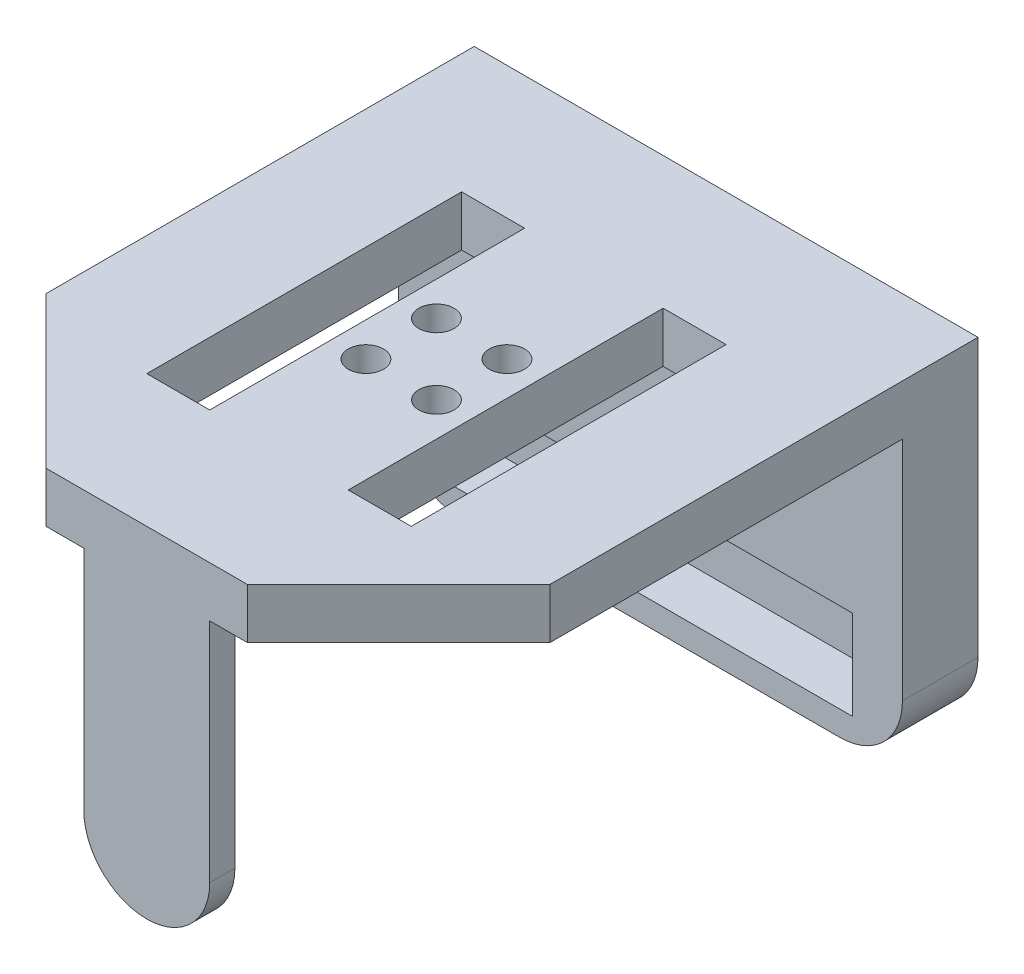
ISO-10303-21;
HEADER;
FILE_DESCRIPTION(('STEP AP214'),'2;1');
FILE_NAME('part.step','',(''),(''),'','','');
FILE_SCHEMA(('AUTOMOTIVE_DESIGN { 1 0 10303 214 1 1 1 1 }'));
ENDSEC;
DATA;
#1=APPLICATION_CONTEXT('core data for automotive mechanical design processes');
#2=APPLICATION_PROTOCOL_DEFINITION('international standard','automotive_design',2000,#1);
#3=PRODUCT_CONTEXT('',#1,'mechanical');
#4=PRODUCT('Part','Part','',(#3));
#5=PRODUCT_RELATED_PRODUCT_CATEGORY('part','',(#4));
#6=PRODUCT_DEFINITION_FORMATION('','',#4);
#7=PRODUCT_DEFINITION_CONTEXT('part definition',#1,'design');
#8=PRODUCT_DEFINITION('design','',#6,#7);
#9=PRODUCT_DEFINITION_SHAPE('','',#8);
#10=(LENGTH_UNIT() NAMED_UNIT(*) SI_UNIT(.MILLI.,.METRE.));
#11=(NAMED_UNIT(*) PLANE_ANGLE_UNIT() SI_UNIT($,.RADIAN.));
#12=(NAMED_UNIT(*) SI_UNIT($,.STERADIAN.) SOLID_ANGLE_UNIT());
#13=UNCERTAINTY_MEASURE_WITH_UNIT(LENGTH_MEASURE(1.E-05),#10,'distance_accuracy_value','');
#14=(GEOMETRIC_REPRESENTATION_CONTEXT(3) GLOBAL_UNCERTAINTY_ASSIGNED_CONTEXT((#13)) GLOBAL_UNIT_ASSIGNED_CONTEXT((#10,
#11,#12)) REPRESENTATION_CONTEXT('',''));
#15=CARTESIAN_POINT('',(0.,0.,0.));
#16=DIRECTION('',(0.,0.,1.));
#17=DIRECTION('',(1.,0.,0.));
#18=AXIS2_PLACEMENT_3D('',#15,#16,#17);
#19=CARTESIAN_POINT('',(-20.,9.5,46.));
#20=DIRECTION('',(0.,1.,0.));
#21=DIRECTION('',(0.,0.,1.));
#22=AXIS2_PLACEMENT_3D('',#19,#20,#21);
#23=PLANE('',#22);
#24=DIRECTION('',(1.,0.,0.));
#25=VECTOR('',#24,1.);
#26=CARTESIAN_POINT('',(-20.,9.5,35.5));
#27=LINE('',#26,#25);
#28=CARTESIAN_POINT('',(-10.5,9.5,35.5));
#29=VERTEX_POINT('',#28);
#30=CARTESIAN_POINT('',(-5.5,9.5,35.5));
#31=VERTEX_POINT('',#30);
#32=EDGE_CURVE('E373',#29,#31,#27,.T.);
#33=ORIENTED_EDGE('',*,*,#32,.T.);
#34=DIRECTION('',(0.,0.,-1.));
#35=VECTOR('',#34,1.);
#36=CARTESIAN_POINT('',(-5.5,9.5,46.));
#37=LINE('',#36,#35);
#38=CARTESIAN_POINT('',(-5.5,9.5,10.5));
#39=VERTEX_POINT('',#38);
#40=EDGE_CURVE('E370',#31,#39,#37,.T.);
#41=ORIENTED_EDGE('',*,*,#40,.T.);
#42=DIRECTION('',(-1.,0.,0.));
#43=VECTOR('',#42,1.);
#44=CARTESIAN_POINT('',(-20.,9.5,10.5));
#45=LINE('',#44,#43);
#46=CARTESIAN_POINT('',(-10.5,9.5,10.5));
#47=VERTEX_POINT('',#46);
#48=EDGE_CURVE('E379',#39,#47,#45,.T.);
#49=ORIENTED_EDGE('',*,*,#48,.T.);
#50=DIRECTION('',(0.,0.,1.));
#51=VECTOR('',#50,1.);
#52=CARTESIAN_POINT('',(-10.5,9.5,46.));
#53=LINE('',#52,#51);
#54=EDGE_CURVE('E376',#47,#29,#53,.T.);
#55=ORIENTED_EDGE('',*,*,#54,.T.);
#56=EDGE_LOOP('',(#33,#41,#49,#55));
#57=FACE_BOUND('',#56,.T.);
#58=CARTESIAN_POINT('',(2.8,9.5,20.2));
#59=DIRECTION('',(0.,1.,0.));
#60=DIRECTION('',(0.,0.,1.));
#61=AXIS2_PLACEMENT_3D('',#58,#59,#60);
#62=CIRCLE('',#61,1.4);
#63=CARTESIAN_POINT('',(2.8,9.5,21.6));
#64=VERTEX_POINT('',#63);
#65=EDGE_CURVE('E382',#64,#64,#62,.T.);
#66=ORIENTED_EDGE('',*,*,#65,.T.);
#67=EDGE_LOOP('',(#66));
#68=FACE_BOUND('',#67,.T.);
#69=CARTESIAN_POINT('',(2.8,9.5,25.8));
#70=DIRECTION('',(0.,1.,0.));
#71=DIRECTION('',(0.,0.,1.));
#72=AXIS2_PLACEMENT_3D('',#69,#70,#71);
#73=CIRCLE('',#72,1.4);
#74=CARTESIAN_POINT('',(2.8,9.5,27.2));
#75=VERTEX_POINT('',#74);
#76=EDGE_CURVE('E385',#75,#75,#73,.T.);
#77=ORIENTED_EDGE('',*,*,#76,.T.);
#78=EDGE_LOOP('',(#77));
#79=FACE_BOUND('',#78,.T.);
#80=CARTESIAN_POINT('',(-2.8,9.5,25.8));
#81=DIRECTION('',(0.,1.,0.));
#82=DIRECTION('',(0.,0.,1.));
#83=AXIS2_PLACEMENT_3D('',#80,#81,#82);
#84=CIRCLE('',#83,1.4);
#85=CARTESIAN_POINT('',(-2.8,9.5,27.2));
#86=VERTEX_POINT('',#85);
#87=EDGE_CURVE('E388',#86,#86,#84,.T.);
#88=ORIENTED_EDGE('',*,*,#87,.T.);
#89=EDGE_LOOP('',(#88));
#90=FACE_BOUND('',#89,.T.);
#91=DIRECTION('',(1.,0.,0.));
#92=VECTOR('',#91,1.);
#93=CARTESIAN_POINT('',(-20.,9.5,35.5));
#94=LINE('',#93,#92);
#95=CARTESIAN_POINT('',(5.50000000000001,9.5,35.5));
#96=VERTEX_POINT('',#95);
#97=CARTESIAN_POINT('',(10.5,9.5,35.5));
#98=VERTEX_POINT('',#97);
#99=EDGE_CURVE('E394',#96,#98,#94,.T.);
#100=ORIENTED_EDGE('',*,*,#99,.T.);
#101=DIRECTION('',(0.,0.,-1.));
#102=VECTOR('',#101,1.);
#103=CARTESIAN_POINT('',(10.5,9.5,46.));
#104=LINE('',#103,#102);
#105=CARTESIAN_POINT('',(10.5,9.5,10.5));
#106=VERTEX_POINT('',#105);
#107=EDGE_CURVE('E391',#98,#106,#104,.T.);
#108=ORIENTED_EDGE('',*,*,#107,.T.);
#109=DIRECTION('',(-1.,0.,0.));
#110=VECTOR('',#109,1.);
#111=CARTESIAN_POINT('',(-20.,9.5,10.5));
#112=LINE('',#111,#110);
#113=CARTESIAN_POINT('',(5.5,9.5,10.5));
#114=VERTEX_POINT('',#113);
#115=EDGE_CURVE('E400',#106,#114,#112,.T.);
#116=ORIENTED_EDGE('',*,*,#115,.T.);
#117=DIRECTION('',(0.,0.,1.));
#118=VECTOR('',#117,1.);
#119=CARTESIAN_POINT('',(5.50000000000001,9.5,46.));
#120=LINE('',#119,#118);
#121=EDGE_CURVE('E397',#114,#96,#120,.T.);
#122=ORIENTED_EDGE('',*,*,#121,.T.);
#123=EDGE_LOOP('',(#100,#108,#116,#122));
#124=FACE_BOUND('',#123,.T.);
#125=CARTESIAN_POINT('',(-2.8,9.5,20.2));
#126=DIRECTION('',(0.,1.,0.));
#127=DIRECTION('',(0.,0.,1.));
#128=AXIS2_PLACEMENT_3D('',#125,#126,#127);
#129=CIRCLE('',#128,1.4);
#130=CARTESIAN_POINT('',(-2.8,9.5,21.6));
#131=VERTEX_POINT('',#130);
#132=EDGE_CURVE('E403',#131,#131,#129,.T.);
#133=ORIENTED_EDGE('',*,*,#132,.T.);
#134=EDGE_LOOP('',(#133));
#135=FACE_BOUND('',#134,.T.);
#136=DIRECTION('',(0.,0.,-1.));
#137=VECTOR('',#136,1.);
#138=CARTESIAN_POINT('',(20.,9.5,46.));
#139=LINE('',#138,#137);
#140=CARTESIAN_POINT('',(20.,9.5,34.));
#141=VERTEX_POINT('',#140);
#142=CARTESIAN_POINT('',(20.,9.5,6.));
#143=VERTEX_POINT('',#142);
#144=EDGE_CURVE('E286',#141,#143,#139,.T.);
#145=ORIENTED_EDGE('',*,*,#144,.F.);
#146=DIRECTION('',(-0.707106781186548,0.,0.707106781186547));
#147=VECTOR('',#146,1.);
#148=CARTESIAN_POINT('',(-6.00000000000002,9.5,60.));
#149=LINE('',#148,#147);
#150=CARTESIAN_POINT('',(7.99999999999999,9.5,46.));
#151=VERTEX_POINT('',#150);
#152=EDGE_CURVE('E220',#141,#151,#149,.T.);
#153=ORIENTED_EDGE('',*,*,#152,.T.);
#154=DIRECTION('',(1.,0.,0.));
#155=VECTOR('',#154,1.);
#156=CARTESIAN_POINT('',(-20.,9.5,46.));
#157=LINE('',#156,#155);
#158=CARTESIAN_POINT('',(5.,9.5,46.));
#159=VERTEX_POINT('',#158);
#160=EDGE_CURVE('E348',#159,#151,#157,.T.);
#161=ORIENTED_EDGE('',*,*,#160,.F.);
#162=DIRECTION('',(0.,0.,1.));
#163=VECTOR('',#162,1.);
#164=CARTESIAN_POINT('',(5.,9.5,46.));
#165=LINE('',#164,#163);
#166=CARTESIAN_POINT('',(5.,9.5,44.));
#167=VERTEX_POINT('',#166);
#168=EDGE_CURVE('E361',#167,#159,#165,.T.);
#169=ORIENTED_EDGE('',*,*,#168,.F.);
#170=DIRECTION('',(1.,0.,0.));
#171=VECTOR('',#170,1.);
#172=CARTESIAN_POINT('',(-5.,9.5,44.));
#173=LINE('',#172,#171);
#174=CARTESIAN_POINT('',(-5.,9.5,44.));
#175=VERTEX_POINT('',#174);
#176=EDGE_CURVE('E364',#175,#167,#173,.T.);
#177=ORIENTED_EDGE('',*,*,#176,.F.);
#178=DIRECTION('',(0.,0.,-1.));
#179=VECTOR('',#178,1.);
#180=CARTESIAN_POINT('',(-5.,9.5,46.));
#181=LINE('',#180,#179);
#182=CARTESIAN_POINT('',(-5.,9.5,46.));
#183=VERTEX_POINT('',#182);
#184=EDGE_CURVE('E367',#183,#175,#181,.T.);
#185=ORIENTED_EDGE('',*,*,#184,.F.);
#186=CARTESIAN_POINT('',(-7.99999999999999,9.5,46.));
#187=VERTEX_POINT('',#186);
#188=EDGE_CURVE('E351',#187,#183,#157,.T.);
#189=ORIENTED_EDGE('',*,*,#188,.F.);
#190=DIRECTION('',(-0.707106781186548,0.,-0.707106781186547));
#191=VECTOR('',#190,1.);
#192=CARTESIAN_POINT('',(-14.,9.5,40.));
#193=LINE('',#192,#191);
#194=CARTESIAN_POINT('',(-20.,9.5,34.));
#195=VERTEX_POINT('',#194);
#196=EDGE_CURVE('E407',#187,#195,#193,.T.);
#197=ORIENTED_EDGE('',*,*,#196,.T.);
#198=DIRECTION('',(0.,0.,-1.));
#199=VECTOR('',#198,1.);
#200=CARTESIAN_POINT('',(-20.,9.5,46.));
#201=LINE('',#200,#199);
#202=CARTESIAN_POINT('',(-20.,9.5,6.));
#203=VERTEX_POINT('',#202);
#204=EDGE_CURVE('E344',#195,#203,#201,.T.);
#205=ORIENTED_EDGE('',*,*,#204,.T.);
#206=DIRECTION('',(1.,0.,0.));
#207=VECTOR('',#206,1.);
#208=CARTESIAN_POINT('',(-20.,9.5,6.));
#209=LINE('',#208,#207);
#210=EDGE_CURVE('E346',#203,#143,#209,.T.);
#211=ORIENTED_EDGE('',*,*,#210,.T.);
#212=EDGE_LOOP('',(#145,#153,#161,#169,#177,#185,#189,#197,#205,#211));
#213=FACE_BOUND('',#212,.T.);
#214=ADVANCED_FACE('F33',(#57,#68,#79,#90,#124,#135,#213),#23,.F.);
#215=CARTESIAN_POINT('',(0.,0.,6.));
#216=DIRECTION('',(0.,0.,-1.));
#217=DIRECTION('',(-1.,0.,0.));
#218=AXIS2_PLACEMENT_3D('',#215,#216,#217);
#219=PLANE('',#218);
#220=DIRECTION('',(-1.,0.,0.));
#221=VECTOR('',#220,1.);
#222=CARTESIAN_POINT('',(-16.05,-4.45,6.));
#223=LINE('',#222,#221);
#224=CARTESIAN_POINT('',(16.05,-4.45,6.));
#225=VERTEX_POINT('',#224);
#226=CARTESIAN_POINT('',(-16.05,-4.45,6.));
#227=VERTEX_POINT('',#226);
#228=EDGE_CURVE('E322',#225,#227,#223,.T.);
#229=ORIENTED_EDGE('',*,*,#228,.F.);
#230=DIRECTION('',(0.,1.,0.));
#231=VECTOR('',#230,1.);
#232=CARTESIAN_POINT('',(16.05,-4.45,6.));
#233=LINE('',#232,#231);
#234=CARTESIAN_POINT('',(16.05,-11.55,6.));
#235=VERTEX_POINT('',#234);
#236=EDGE_CURVE('E325',#235,#225,#233,.T.);
#237=ORIENTED_EDGE('',*,*,#236,.F.);
#238=DIRECTION('',(1.,0.,0.));
#239=VECTOR('',#238,1.);
#240=CARTESIAN_POINT('',(-16.05,-11.55,6.));
#241=LINE('',#240,#239);
#242=CARTESIAN_POINT('',(-16.05,-11.55,6.));
#243=VERTEX_POINT('',#242);
#244=EDGE_CURVE('E315',#243,#235,#241,.T.);
#245=ORIENTED_EDGE('',*,*,#244,.F.);
#246=DIRECTION('',(0.,-1.,0.));
#247=VECTOR('',#246,1.);
#248=CARTESIAN_POINT('',(-16.05,-4.45,6.));
#249=LINE('',#248,#247);
#250=EDGE_CURVE('E319',#227,#243,#249,.T.);
#251=ORIENTED_EDGE('',*,*,#250,.F.);
#252=EDGE_LOOP('',(#229,#237,#245,#251));
#253=FACE_BOUND('',#252,.T.);
#254=DIRECTION('',(1.,0.,0.));
#255=VECTOR('',#254,1.);
#256=CARTESIAN_POINT('',(-20.,-13.5,6.));
#257=LINE('',#256,#255);
#258=CARTESIAN_POINT('',(-15.,-13.5,6.));
#259=VERTEX_POINT('',#258);
#260=CARTESIAN_POINT('',(15.,-13.5,6.));
#261=VERTEX_POINT('',#260);
#262=EDGE_CURVE('E249',#259,#261,#257,.T.);
#263=ORIENTED_EDGE('',*,*,#262,.T.);
#264=CARTESIAN_POINT('',(15.,-8.5,6.));
#265=DIRECTION('',(0.,0.,-1.));
#266=DIRECTION('',(-1.,0.,0.));
#267=AXIS2_PLACEMENT_3D('',#264,#265,#266);
#268=CIRCLE('',#267,5.);
#269=CARTESIAN_POINT('',(20.,-8.5,6.));
#270=VERTEX_POINT('',#269);
#271=EDGE_CURVE('E42',#261,#270,#268,.F.);
#272=ORIENTED_EDGE('',*,*,#271,.T.);
#273=DIRECTION('',(0.,1.,0.));
#274=VECTOR('',#273,1.);
#275=CARTESIAN_POINT('',(20.,-13.5,6.));
#276=LINE('',#275,#274);
#277=EDGE_CURVE('E283',#270,#143,#276,.T.);
#278=ORIENTED_EDGE('',*,*,#277,.T.);
#279=ORIENTED_EDGE('',*,*,#210,.F.);
#280=DIRECTION('',(0.,-1.,0.));
#281=VECTOR('',#280,1.);
#282=CARTESIAN_POINT('',(-20.,-13.5,6.));
#283=LINE('',#282,#281);
#284=CARTESIAN_POINT('',(-20.,-8.5,6.));
#285=VERTEX_POINT('',#284);
#286=EDGE_CURVE('E288',#203,#285,#283,.T.);
#287=ORIENTED_EDGE('',*,*,#286,.T.);
#288=CARTESIAN_POINT('',(-15.,-8.5,6.));
#289=DIRECTION('',(0.,0.,-1.));
#290=DIRECTION('',(-1.,0.,0.));
#291=AXIS2_PLACEMENT_3D('',#288,#289,#290);
#292=CIRCLE('',#291,5.);
#293=EDGE_CURVE('E277',#285,#259,#292,.F.);
#294=ORIENTED_EDGE('',*,*,#293,.T.);
#295=EDGE_LOOP('',(#263,#272,#278,#279,#287,#294));
#296=FACE_BOUND('',#295,.T.);
#297=ADVANCED_FACE('F281',(#253,#296),#219,.F.);
#298=CARTESIAN_POINT('',(20.,-13.5,6.));
#299=DIRECTION('',(-1.,0.,0.));
#300=DIRECTION('',(0.,0.,1.));
#301=AXIS2_PLACEMENT_3D('',#298,#299,#300);
#302=PLANE('',#301);
#303=ORIENTED_EDGE('',*,*,#277,.F.);
#304=DIRECTION('',(0.,0.,-1.));
#305=VECTOR('',#304,1.);
#306=CARTESIAN_POINT('',(20.,-8.5,6.));
#307=LINE('',#306,#305);
#308=CARTESIAN_POINT('',(20.,-8.5,0.));
#309=VERTEX_POINT('',#308);
#310=EDGE_CURVE('E267',#270,#309,#307,.T.);
#311=ORIENTED_EDGE('',*,*,#310,.T.);
#312=DIRECTION('',(0.,1.,0.));
#313=VECTOR('',#312,1.);
#314=CARTESIAN_POINT('',(20.,-13.5,0.));
#315=LINE('',#314,#313);
#316=CARTESIAN_POINT('',(20.,13.5,0.));
#317=VERTEX_POINT('',#316);
#318=EDGE_CURVE('E242',#309,#317,#315,.T.);
#319=ORIENTED_EDGE('',*,*,#318,.T.);
#320=DIRECTION('',(0.,0.,-1.));
#321=VECTOR('',#320,1.);
#322=CARTESIAN_POINT('',(20.,13.5,6.));
#323=LINE('',#322,#321);
#324=CARTESIAN_POINT('',(20.,13.5,34.));
#325=VERTEX_POINT('',#324);
#326=EDGE_CURVE('E232',#325,#317,#323,.T.);
#327=ORIENTED_EDGE('',*,*,#326,.F.);
#328=DIRECTION('',(0.,1.,0.));
#329=VECTOR('',#328,1.);
#330=CARTESIAN_POINT('',(20.,-13.5,34.));
#331=LINE('',#330,#329);
#332=EDGE_CURVE('E214',#141,#325,#331,.T.);
#333=ORIENTED_EDGE('',*,*,#332,.F.);
#334=ORIENTED_EDGE('',*,*,#144,.T.);
#335=EDGE_LOOP('',(#303,#311,#319,#327,#333,#334));
#336=FACE_BOUND('',#335,.T.);
#337=ADVANCED_FACE('F239',(#336),#302,.F.);
#338=CARTESIAN_POINT('',(-20.,13.5,6.));
#339=DIRECTION('',(0.,-1.,0.));
#340=DIRECTION('',(0.,0.,-1.));
#341=AXIS2_PLACEMENT_3D('',#338,#339,#340);
#342=PLANE('',#341);
#343=DIRECTION('',(-1.,0.,0.));
#344=VECTOR('',#343,1.);
#345=CARTESIAN_POINT('',(-10.5,13.5,10.5));
#346=LINE('',#345,#344);
#347=CARTESIAN_POINT('',(-5.5,13.5,10.5));
#348=VERTEX_POINT('',#347);
#349=CARTESIAN_POINT('',(-10.5,13.5,10.5));
#350=VERTEX_POINT('',#349);
#351=EDGE_CURVE('E435',#348,#350,#346,.T.);
#352=ORIENTED_EDGE('',*,*,#351,.F.);
#353=DIRECTION('',(0.,0.,-1.));
#354=VECTOR('',#353,1.);
#355=CARTESIAN_POINT('',(-5.5,13.5,35.5));
#356=LINE('',#355,#354);
#357=CARTESIAN_POINT('',(-5.5,13.5,35.5));
#358=VERTEX_POINT('',#357);
#359=EDGE_CURVE('E438',#358,#348,#356,.T.);
#360=ORIENTED_EDGE('',*,*,#359,.F.);
#361=DIRECTION('',(1.,0.,0.));
#362=VECTOR('',#361,1.);
#363=CARTESIAN_POINT('',(-10.5,13.5,35.5));
#364=LINE('',#363,#362);
#365=CARTESIAN_POINT('',(-10.5,13.5,35.5));
#366=VERTEX_POINT('',#365);
#367=EDGE_CURVE('E424',#366,#358,#364,.T.);
#368=ORIENTED_EDGE('',*,*,#367,.F.);
#369=DIRECTION('',(0.,0.,1.));
#370=VECTOR('',#369,1.);
#371=CARTESIAN_POINT('',(-10.5,13.5,35.5));
#372=LINE('',#371,#370);
#373=EDGE_CURVE('E432',#350,#366,#372,.T.);
#374=ORIENTED_EDGE('',*,*,#373,.F.);
#375=EDGE_LOOP('',(#352,#360,#368,#374));
#376=FACE_BOUND('',#375,.T.);
#377=CARTESIAN_POINT('',(2.8,13.5,20.2));
#378=DIRECTION('',(0.,1.,0.));
#379=DIRECTION('',(0.,0.,-1.));
#380=AXIS2_PLACEMENT_3D('',#377,#378,#379);
#381=CIRCLE('',#380,1.4);
#382=CARTESIAN_POINT('',(2.8,13.5,18.8));
#383=VERTEX_POINT('',#382);
#384=EDGE_CURVE('E417',#383,#383,#381,.T.);
#385=ORIENTED_EDGE('',*,*,#384,.F.);
#386=EDGE_LOOP('',(#385));
#387=FACE_BOUND('',#386,.T.);
#388=CARTESIAN_POINT('',(2.8,13.5,25.8));
#389=DIRECTION('',(0.,1.,0.));
#390=DIRECTION('',(0.,0.,1.));
#391=AXIS2_PLACEMENT_3D('',#388,#389,#390);
#392=CIRCLE('',#391,1.4);
#393=CARTESIAN_POINT('',(2.8,13.5,27.2));
#394=VERTEX_POINT('',#393);
#395=EDGE_CURVE('E414',#394,#394,#392,.T.);
#396=ORIENTED_EDGE('',*,*,#395,.F.);
#397=EDGE_LOOP('',(#396));
#398=FACE_BOUND('',#397,.T.);
#399=CARTESIAN_POINT('',(-2.8,13.5,25.8));
#400=DIRECTION('',(0.,1.,0.));
#401=DIRECTION('',(0.,0.,-1.));
#402=AXIS2_PLACEMENT_3D('',#399,#400,#401);
#403=CIRCLE('',#402,1.4);
#404=CARTESIAN_POINT('',(-2.8,13.5,24.4));
#405=VERTEX_POINT('',#404);
#406=EDGE_CURVE('E413',#405,#405,#403,.T.);
#407=ORIENTED_EDGE('',*,*,#406,.F.);
#408=EDGE_LOOP('',(#407));
#409=FACE_BOUND('',#408,.T.);
#410=DIRECTION('',(-1.,0.,0.));
#411=VECTOR('',#410,1.);
#412=CARTESIAN_POINT('',(10.5,13.5,10.5));
#413=LINE('',#412,#411);
#414=CARTESIAN_POINT('',(10.5,13.5,10.5));
#415=VERTEX_POINT('',#414);
#416=CARTESIAN_POINT('',(5.5,13.5,10.5));
#417=VERTEX_POINT('',#416);
#418=EDGE_CURVE('E462',#415,#417,#413,.T.);
#419=ORIENTED_EDGE('',*,*,#418,.F.);
#420=DIRECTION('',(0.,0.,-1.));
#421=VECTOR('',#420,1.);
#422=CARTESIAN_POINT('',(10.5,13.5,35.5));
#423=LINE('',#422,#421);
#424=CARTESIAN_POINT('',(10.5,13.5,35.5));
#425=VERTEX_POINT('',#424);
#426=EDGE_CURVE('E446',#425,#415,#423,.T.);
#427=ORIENTED_EDGE('',*,*,#426,.F.);
#428=DIRECTION('',(1.,0.,0.));
#429=VECTOR('',#428,1.);
#430=CARTESIAN_POINT('',(10.5,13.5,35.5));
#431=LINE('',#430,#429);
#432=CARTESIAN_POINT('',(5.50000000000001,13.5,35.5));
#433=VERTEX_POINT('',#432);
#434=EDGE_CURVE('E452',#433,#425,#431,.T.);
#435=ORIENTED_EDGE('',*,*,#434,.F.);
#436=DIRECTION('',(0.,0.,1.));
#437=VECTOR('',#436,1.);
#438=CARTESIAN_POINT('',(5.50000000000001,13.5,35.5));
#439=LINE('',#438,#437);
#440=EDGE_CURVE('E459',#417,#433,#439,.T.);
#441=ORIENTED_EDGE('',*,*,#440,.F.);
#442=EDGE_LOOP('',(#419,#427,#435,#441));
#443=FACE_BOUND('',#442,.T.);
#444=CARTESIAN_POINT('',(-2.8,13.5,20.2));
#445=DIRECTION('',(0.,1.,0.));
#446=DIRECTION('',(0.,0.,1.));
#447=AXIS2_PLACEMENT_3D('',#444,#445,#446);
#448=CIRCLE('',#447,1.4);
#449=CARTESIAN_POINT('',(-2.8,13.5,21.6));
#450=VERTEX_POINT('',#449);
#451=EDGE_CURVE('E410',#450,#450,#448,.T.);
#452=ORIENTED_EDGE('',*,*,#451,.F.);
#453=EDGE_LOOP('',(#452));
#454=FACE_BOUND('',#453,.T.);
#455=DIRECTION('',(1.,0.,0.));
#456=VECTOR('',#455,1.);
#457=CARTESIAN_POINT('',(-20.,13.5,46.));
#458=LINE('',#457,#456);
#459=CARTESIAN_POINT('',(-8.,13.5,46.));
#460=VERTEX_POINT('',#459);
#461=CARTESIAN_POINT('',(7.99999999999999,13.5,46.));
#462=VERTEX_POINT('',#461);
#463=EDGE_CURVE('E236',#460,#462,#458,.T.);
#464=ORIENTED_EDGE('',*,*,#463,.T.);
#465=DIRECTION('',(-0.707106781186548,0.,0.707106781186547));
#466=VECTOR('',#465,1.);
#467=CARTESIAN_POINT('',(20.,13.5,34.));
#468=LINE('',#467,#466);
#469=EDGE_CURVE('E217',#325,#462,#468,.T.);
#470=ORIENTED_EDGE('',*,*,#469,.F.);
#471=ORIENTED_EDGE('',*,*,#326,.T.);
#472=DIRECTION('',(-1.,0.,0.));
#473=VECTOR('',#472,1.);
#474=CARTESIAN_POINT('',(-20.,13.5,0.));
#475=LINE('',#474,#473);
#476=CARTESIAN_POINT('',(-20.,13.5,0.));
#477=VERTEX_POINT('',#476);
#478=EDGE_CURVE('E298',#317,#477,#475,.T.);
#479=ORIENTED_EDGE('',*,*,#478,.T.);
#480=DIRECTION('',(0.,0.,-1.));
#481=VECTOR('',#480,1.);
#482=CARTESIAN_POINT('',(-20.,13.5,6.));
#483=LINE('',#482,#481);
#484=CARTESIAN_POINT('',(-20.,13.5,34.));
#485=VERTEX_POINT('',#484);
#486=EDGE_CURVE('E244',#485,#477,#483,.T.);
#487=ORIENTED_EDGE('',*,*,#486,.F.);
#488=DIRECTION('',(-0.707106781186548,0.,-0.707106781186547));
#489=VECTOR('',#488,1.);
#490=CARTESIAN_POINT('',(-20.,13.5,34.));
#491=LINE('',#490,#489);
#492=EDGE_CURVE('E225',#460,#485,#491,.T.);
#493=ORIENTED_EDGE('',*,*,#492,.F.);
#494=EDGE_LOOP('',(#464,#470,#471,#479,#487,#493));
#495=FACE_BOUND('',#494,.T.);
#496=ADVANCED_FACE('F230',(#376,#387,#398,#409,#443,#454,#495),#342,.F.);
#497=CARTESIAN_POINT('',(-20.,-13.5,6.));
#498=DIRECTION('',(1.,0.,0.));
#499=DIRECTION('',(0.,0.,-1.));
#500=AXIS2_PLACEMENT_3D('',#497,#498,#499);
#501=PLANE('',#500);
#502=DIRECTION('',(0.,-1.,0.));
#503=VECTOR('',#502,1.);
#504=CARTESIAN_POINT('',(-20.,-13.5,0.));
#505=LINE('',#504,#503);
#506=CARTESIAN_POINT('',(-20.,-8.5,0.));
#507=VERTEX_POINT('',#506);
#508=EDGE_CURVE('E297',#477,#507,#505,.T.);
#509=ORIENTED_EDGE('',*,*,#508,.T.);
#510=DIRECTION('',(0.,0.,-1.));
#511=VECTOR('',#510,1.);
#512=CARTESIAN_POINT('',(-20.,-8.5,6.));
#513=LINE('',#512,#511);
#514=EDGE_CURVE('E11',#507,#285,#513,.F.);
#515=ORIENTED_EDGE('',*,*,#514,.T.);
#516=ORIENTED_EDGE('',*,*,#286,.F.);
#517=ORIENTED_EDGE('',*,*,#204,.F.);
#518=DIRECTION('',(0.,1.,0.));
#519=VECTOR('',#518,1.);
#520=CARTESIAN_POINT('',(-20.,-13.5,34.));
#521=LINE('',#520,#519);
#522=EDGE_CURVE('E443',#195,#485,#521,.T.);
#523=ORIENTED_EDGE('',*,*,#522,.T.);
#524=ORIENTED_EDGE('',*,*,#486,.T.);
#525=EDGE_LOOP('',(#509,#515,#516,#517,#523,#524));
#526=FACE_BOUND('',#525,.T.);
#527=ADVANCED_FACE('F537',(#526),#501,.F.);
#528=CARTESIAN_POINT('',(-20.,-13.5,6.));
#529=DIRECTION('',(0.,1.,0.));
#530=DIRECTION('',(0.,0.,1.));
#531=AXIS2_PLACEMENT_3D('',#528,#529,#530);
#532=PLANE('',#531);
#533=DIRECTION('',(1.,0.,0.));
#534=VECTOR('',#533,1.);
#535=CARTESIAN_POINT('',(-20.,-13.5,0.));
#536=LINE('',#535,#534);
#537=CARTESIAN_POINT('',(-15.,-13.5,0.));
#538=VERTEX_POINT('',#537);
#539=CARTESIAN_POINT('',(15.,-13.5,0.));
#540=VERTEX_POINT('',#539);
#541=EDGE_CURVE('E289',#538,#540,#536,.T.);
#542=ORIENTED_EDGE('',*,*,#541,.T.);
#543=DIRECTION('',(0.,0.,-1.));
#544=VECTOR('',#543,1.);
#545=CARTESIAN_POINT('',(15.,-13.5,6.));
#546=LINE('',#545,#544);
#547=EDGE_CURVE('E55',#540,#261,#546,.F.);
#548=ORIENTED_EDGE('',*,*,#547,.T.);
#549=ORIENTED_EDGE('',*,*,#262,.F.);
#550=DIRECTION('',(0.,0.,-1.));
#551=VECTOR('',#550,1.);
#552=CARTESIAN_POINT('',(-15.,-13.5,6.));
#553=LINE('',#552,#551);
#554=EDGE_CURVE('E273',#259,#538,#553,.T.);
#555=ORIENTED_EDGE('',*,*,#554,.T.);
#556=EDGE_LOOP('',(#542,#548,#549,#555));
#557=FACE_BOUND('',#556,.T.);
#558=ADVANCED_FACE('F295',(#557),#532,.F.);
#559=CARTESIAN_POINT('',(0.,0.,0.));
#560=DIRECTION('',(0.,0.,-1.));
#561=DIRECTION('',(-1.,0.,0.));
#562=AXIS2_PLACEMENT_3D('',#559,#560,#561);
#563=PLANE('',#562);
#564=CARTESIAN_POINT('',(0.,-8.,0.));
#565=DIRECTION('',(0.,0.,1.));
#566=DIRECTION('',(1.,0.,0.));
#567=AXIS2_PLACEMENT_3D('',#564,#565,#566);
#568=CIRCLE('',#567,1.05);
#569=CARTESIAN_POINT('',(1.05,-8.,0.));
#570=VERTEX_POINT('',#569);
#571=EDGE_CURVE('E327',#570,#570,#568,.T.);
#572=ORIENTED_EDGE('',*,*,#571,.T.);
#573=EDGE_LOOP('',(#572));
#574=FACE_BOUND('',#573,.T.);
#575=ORIENTED_EDGE('',*,*,#318,.F.);
#576=CARTESIAN_POINT('',(15.,-8.5,0.));
#577=DIRECTION('',(0.,0.,-1.));
#578=DIRECTION('',(-1.,0.,0.));
#579=AXIS2_PLACEMENT_3D('',#576,#577,#578);
#580=CIRCLE('',#579,5.);
#581=EDGE_CURVE('E271',#309,#540,#580,.T.);
#582=ORIENTED_EDGE('',*,*,#581,.T.);
#583=ORIENTED_EDGE('',*,*,#541,.F.);
#584=CARTESIAN_POINT('',(-15.,-8.5,0.));
#585=DIRECTION('',(0.,0.,-1.));
#586=DIRECTION('',(-1.,0.,0.));
#587=AXIS2_PLACEMENT_3D('',#584,#585,#586);
#588=CIRCLE('',#587,5.);
#589=EDGE_CURVE('E269',#538,#507,#588,.T.);
#590=ORIENTED_EDGE('',*,*,#589,.T.);
#591=ORIENTED_EDGE('',*,*,#508,.F.);
#592=ORIENTED_EDGE('',*,*,#478,.F.);
#593=EDGE_LOOP('',(#575,#582,#583,#590,#591,#592));
#594=FACE_BOUND('',#593,.T.);
#595=ADVANCED_FACE('F294',(#574,#594),#563,.T.);
#596=CARTESIAN_POINT('',(16.05,-4.45,2.));
#597=DIRECTION('',(1.,0.,0.));
#598=DIRECTION('',(0.,0.,-1.));
#599=AXIS2_PLACEMENT_3D('',#596,#597,#598);
#600=PLANE('',#599);
#601=ORIENTED_EDGE('',*,*,#236,.T.);
#602=DIRECTION('',(0.,0.,1.));
#603=VECTOR('',#602,1.);
#604=CARTESIAN_POINT('',(16.05,-4.45,2.));
#605=LINE('',#604,#603);
#606=CARTESIAN_POINT('',(16.05,-4.45,2.));
#607=VERTEX_POINT('',#606);
#608=EDGE_CURVE('E306',#607,#225,#605,.T.);
#609=ORIENTED_EDGE('',*,*,#608,.F.);
#610=DIRECTION('',(0.,1.,0.));
#611=VECTOR('',#610,1.);
#612=CARTESIAN_POINT('',(16.05,-4.45,2.));
#613=LINE('',#612,#611);
#614=CARTESIAN_POINT('',(16.05,-11.55,2.));
#615=VERTEX_POINT('',#614);
#616=EDGE_CURVE('E318',#615,#607,#613,.T.);
#617=ORIENTED_EDGE('',*,*,#616,.F.);
#618=DIRECTION('',(0.,0.,1.));
#619=VECTOR('',#618,1.);
#620=CARTESIAN_POINT('',(16.05,-11.55,2.));
#621=LINE('',#620,#619);
#622=EDGE_CURVE('E303',#615,#235,#621,.T.);
#623=ORIENTED_EDGE('',*,*,#622,.T.);
#624=EDGE_LOOP('',(#601,#609,#617,#623));
#625=FACE_BOUND('',#624,.T.);
#626=ADVANCED_FACE('F521',(#625),#600,.F.);
#627=CARTESIAN_POINT('',(-16.05,-11.55,2.));
#628=DIRECTION('',(0.,-1.,0.));
#629=DIRECTION('',(0.,0.,-1.));
#630=AXIS2_PLACEMENT_3D('',#627,#628,#629);
#631=PLANE('',#630);
#632=ORIENTED_EDGE('',*,*,#244,.T.);
#633=ORIENTED_EDGE('',*,*,#622,.F.);
#634=DIRECTION('',(1.,0.,0.));
#635=VECTOR('',#634,1.);
#636=CARTESIAN_POINT('',(-16.05,-11.55,2.));
#637=LINE('',#636,#635);
#638=CARTESIAN_POINT('',(-16.05,-11.55,2.));
#639=VERTEX_POINT('',#638);
#640=EDGE_CURVE('E310',#639,#615,#637,.T.);
#641=ORIENTED_EDGE('',*,*,#640,.F.);
#642=DIRECTION('',(0.,0.,1.));
#643=VECTOR('',#642,1.);
#644=CARTESIAN_POINT('',(-16.05,-11.55,2.));
#645=LINE('',#644,#643);
#646=EDGE_CURVE('E312',#639,#243,#645,.T.);
#647=ORIENTED_EDGE('',*,*,#646,.T.);
#648=EDGE_LOOP('',(#632,#633,#641,#647));
#649=FACE_BOUND('',#648,.T.);
#650=ADVANCED_FACE('F517',(#649),#631,.F.);
#651=CARTESIAN_POINT('',(-16.05,-4.45,2.));
#652=DIRECTION('',(-1.,0.,0.));
#653=DIRECTION('',(0.,0.,1.));
#654=AXIS2_PLACEMENT_3D('',#651,#652,#653);
#655=PLANE('',#654);
#656=ORIENTED_EDGE('',*,*,#250,.T.);
#657=ORIENTED_EDGE('',*,*,#646,.F.);
#658=DIRECTION('',(0.,-1.,0.));
#659=VECTOR('',#658,1.);
#660=CARTESIAN_POINT('',(-16.05,-4.45,2.));
#661=LINE('',#660,#659);
#662=CARTESIAN_POINT('',(-16.05,-4.45,2.));
#663=VERTEX_POINT('',#662);
#664=EDGE_CURVE('E330',#663,#639,#661,.T.);
#665=ORIENTED_EDGE('',*,*,#664,.F.);
#666=DIRECTION('',(0.,0.,1.));
#667=VECTOR('',#666,1.);
#668=CARTESIAN_POINT('',(-16.05,-4.45,2.));
#669=LINE('',#668,#667);
#670=EDGE_CURVE('E309',#663,#227,#669,.T.);
#671=ORIENTED_EDGE('',*,*,#670,.T.);
#672=EDGE_LOOP('',(#656,#657,#665,#671));
#673=FACE_BOUND('',#672,.T.);
#674=ADVANCED_FACE('F520',(#673),#655,.F.);
#675=CARTESIAN_POINT('',(-16.05,-4.45,2.));
#676=DIRECTION('',(0.,1.,0.));
#677=DIRECTION('',(0.,0.,1.));
#678=AXIS2_PLACEMENT_3D('',#675,#676,#677);
#679=PLANE('',#678);
#680=ORIENTED_EDGE('',*,*,#228,.T.);
#681=ORIENTED_EDGE('',*,*,#670,.F.);
#682=DIRECTION('',(-1.,0.,0.));
#683=VECTOR('',#682,1.);
#684=CARTESIAN_POINT('',(-16.05,-4.45,2.));
#685=LINE('',#684,#683);
#686=EDGE_CURVE('E333',#607,#663,#685,.T.);
#687=ORIENTED_EDGE('',*,*,#686,.F.);
#688=ORIENTED_EDGE('',*,*,#608,.T.);
#689=EDGE_LOOP('',(#680,#681,#687,#688));
#690=FACE_BOUND('',#689,.T.);
#691=ADVANCED_FACE('F515',(#690),#679,.F.);
#692=CARTESIAN_POINT('',(0.,0.,2.));
#693=DIRECTION('',(0.,0.,1.));
#694=DIRECTION('',(1.,0.,0.));
#695=AXIS2_PLACEMENT_3D('',#692,#693,#694);
#696=PLANE('',#695);
#697=CARTESIAN_POINT('',(0.,-8.,2.));
#698=DIRECTION('',(0.,0.,1.));
#699=DIRECTION('',(1.,0.,0.));
#700=AXIS2_PLACEMENT_3D('',#697,#698,#699);
#701=CIRCLE('',#700,1.05);
#702=CARTESIAN_POINT('',(1.05,-8.,2.));
#703=VERTEX_POINT('',#702);
#704=EDGE_CURVE('E338',#703,#703,#701,.T.);
#705=ORIENTED_EDGE('',*,*,#704,.F.);
#706=EDGE_LOOP('',(#705));
#707=FACE_BOUND('',#706,.T.);
#708=ORIENTED_EDGE('',*,*,#616,.T.);
#709=ORIENTED_EDGE('',*,*,#686,.T.);
#710=ORIENTED_EDGE('',*,*,#664,.T.);
#711=ORIENTED_EDGE('',*,*,#640,.T.);
#712=EDGE_LOOP('',(#708,#709,#710,#711));
#713=FACE_BOUND('',#712,.T.);
#714=ADVANCED_FACE('F511',(#707,#713),#696,.T.);
#715=CARTESIAN_POINT('',(0.,-8.,0.));
#716=DIRECTION('',(0.,0.,1.));
#717=DIRECTION('',(1.,0.,0.));
#718=AXIS2_PLACEMENT_3D('',#715,#716,#717);
#719=CYLINDRICAL_SURFACE('',#718,1.05);
#720=ORIENTED_EDGE('',*,*,#571,.F.);
#721=EDGE_LOOP('',(#720));
#722=FACE_BOUND('',#721,.T.);
#723=ORIENTED_EDGE('',*,*,#704,.T.);
#724=EDGE_LOOP('',(#723));
#725=FACE_BOUND('',#724,.T.);
#726=ADVANCED_FACE('F508',(#722,#725),#719,.F.);
#727=CARTESIAN_POINT('',(0.,0.,46.));
#728=DIRECTION('',(0.,0.,-1.));
#729=DIRECTION('',(-1.,0.,0.));
#730=AXIS2_PLACEMENT_3D('',#727,#728,#729);
#731=PLANE('',#730);
#732=DIRECTION('',(0.,1.,0.));
#733=VECTOR('',#732,1.);
#734=CARTESIAN_POINT('',(-5.,-13.5,46.));
#735=LINE('',#734,#733);
#736=CARTESIAN_POINT('',(-5.,-8.5,46.));
#737=VERTEX_POINT('',#736);
#738=EDGE_CURVE('E359',#737,#183,#735,.T.);
#739=ORIENTED_EDGE('',*,*,#738,.F.);
#740=CARTESIAN_POINT('',(0.,-8.5,46.));
#741=DIRECTION('',(0.,0.,-1.));
#742=DIRECTION('',(-1.,0.,0.));
#743=AXIS2_PLACEMENT_3D('',#740,#741,#742);
#744=CIRCLE('',#743,5.);
#745=CARTESIAN_POINT('',(0.,-13.5,46.));
#746=VERTEX_POINT('',#745);
#747=EDGE_CURVE('E263',#737,#746,#744,.F.);
#748=ORIENTED_EDGE('',*,*,#747,.T.);
#749=CARTESIAN_POINT('',(0.,-8.5,46.));
#750=DIRECTION('',(0.,0.,-1.));
#751=DIRECTION('',(-1.,0.,0.));
#752=AXIS2_PLACEMENT_3D('',#749,#750,#751);
#753=CIRCLE('',#752,5.);
#754=CARTESIAN_POINT('',(5.,-8.5,46.));
#755=VERTEX_POINT('',#754);
#756=EDGE_CURVE('E261',#746,#755,#753,.F.);
#757=ORIENTED_EDGE('',*,*,#756,.T.);
#758=DIRECTION('',(0.,1.,0.));
#759=VECTOR('',#758,1.);
#760=CARTESIAN_POINT('',(5.,-13.5,46.));
#761=LINE('',#760,#759);
#762=EDGE_CURVE('E357',#755,#159,#761,.T.);
#763=ORIENTED_EDGE('',*,*,#762,.T.);
#764=ORIENTED_EDGE('',*,*,#160,.T.);
#765=DIRECTION('',(0.,1.,0.));
#766=VECTOR('',#765,1.);
#767=CARTESIAN_POINT('',(7.99999999999999,0.,46.));
#768=LINE('',#767,#766);
#769=EDGE_CURVE('E247',#151,#462,#768,.T.);
#770=ORIENTED_EDGE('',*,*,#769,.T.);
#771=ORIENTED_EDGE('',*,*,#463,.F.);
#772=DIRECTION('',(0.,-1.,0.));
#773=VECTOR('',#772,1.);
#774=CARTESIAN_POINT('',(-7.99999999999999,0.,46.));
#775=LINE('',#774,#773);
#776=EDGE_CURVE('E243',#460,#187,#775,.T.);
#777=ORIENTED_EDGE('',*,*,#776,.T.);
#778=ORIENTED_EDGE('',*,*,#188,.T.);
#779=EDGE_LOOP('',(#739,#748,#757,#763,#764,#770,#771,#777,#778));
#780=FACE_BOUND('',#779,.T.);
#781=ADVANCED_FACE('F506',(#780),#731,.F.);
#782=CARTESIAN_POINT('',(-5.,-13.5,46.));
#783=DIRECTION('',(1.,0.,0.));
#784=DIRECTION('',(0.,0.,-1.));
#785=AXIS2_PLACEMENT_3D('',#782,#783,#784);
#786=PLANE('',#785);
#787=DIRECTION('',(0.,1.,0.));
#788=VECTOR('',#787,1.);
#789=CARTESIAN_POINT('',(-5.,-13.5,44.));
#790=LINE('',#789,#788);
#791=CARTESIAN_POINT('',(-5.,-8.5,44.));
#792=VERTEX_POINT('',#791);
#793=EDGE_CURVE('E349',#792,#175,#790,.T.);
#794=ORIENTED_EDGE('',*,*,#793,.F.);
#795=DIRECTION('',(0.,0.,-1.));
#796=VECTOR('',#795,1.);
#797=CARTESIAN_POINT('',(-5.,-8.5,46.));
#798=LINE('',#797,#796);
#799=EDGE_CURVE('E258',#792,#737,#798,.F.);
#800=ORIENTED_EDGE('',*,*,#799,.T.);
#801=ORIENTED_EDGE('',*,*,#738,.T.);
#802=ORIENTED_EDGE('',*,*,#184,.T.);
#803=EDGE_LOOP('',(#794,#800,#801,#802));
#804=FACE_BOUND('',#803,.T.);
#805=ADVANCED_FACE('F586',(#804),#786,.F.);
#806=CARTESIAN_POINT('',(-5.,-13.5,44.));
#807=DIRECTION('',(0.,0.,1.));
#808=DIRECTION('',(1.,0.,0.));
#809=AXIS2_PLACEMENT_3D('',#806,#807,#808);
#810=PLANE('',#809);
#811=CARTESIAN_POINT('',(0.,-8.5,44.));
#812=DIRECTION('',(0.,0.,1.));
#813=DIRECTION('',(1.,0.,0.));
#814=AXIS2_PLACEMENT_3D('',#811,#812,#813);
#815=CIRCLE('',#814,5.);
#816=CARTESIAN_POINT('',(5.,-8.5,44.));
#817=VERTEX_POINT('',#816);
#818=CARTESIAN_POINT('',(0.,-13.5,44.));
#819=VERTEX_POINT('',#818);
#820=EDGE_CURVE('E254',#817,#819,#815,.F.);
#821=ORIENTED_EDGE('',*,*,#820,.T.);
#822=CARTESIAN_POINT('',(0.,-8.5,44.));
#823=DIRECTION('',(0.,0.,1.));
#824=DIRECTION('',(1.,0.,0.));
#825=AXIS2_PLACEMENT_3D('',#822,#823,#824);
#826=CIRCLE('',#825,5.);
#827=EDGE_CURVE('E256',#819,#792,#826,.F.);
#828=ORIENTED_EDGE('',*,*,#827,.T.);
#829=ORIENTED_EDGE('',*,*,#793,.T.);
#830=ORIENTED_EDGE('',*,*,#176,.T.);
#831=DIRECTION('',(0.,1.,0.));
#832=VECTOR('',#831,1.);
#833=CARTESIAN_POINT('',(5.,-13.5,44.));
#834=LINE('',#833,#832);
#835=EDGE_CURVE('E355',#817,#167,#834,.T.);
#836=ORIENTED_EDGE('',*,*,#835,.F.);
#837=EDGE_LOOP('',(#821,#828,#829,#830,#836));
#838=FACE_BOUND('',#837,.T.);
#839=ADVANCED_FACE('F581',(#838),#810,.F.);
#840=CARTESIAN_POINT('',(5.,-13.5,46.));
#841=DIRECTION('',(-1.,0.,0.));
#842=DIRECTION('',(0.,0.,1.));
#843=AXIS2_PLACEMENT_3D('',#840,#841,#842);
#844=PLANE('',#843);
#845=ORIENTED_EDGE('',*,*,#762,.F.);
#846=DIRECTION('',(0.,0.,1.));
#847=VECTOR('',#846,1.);
#848=CARTESIAN_POINT('',(5.,-8.5,44.));
#849=LINE('',#848,#847);
#850=EDGE_CURVE('E265',#755,#817,#849,.F.);
#851=ORIENTED_EDGE('',*,*,#850,.T.);
#852=ORIENTED_EDGE('',*,*,#835,.T.);
#853=ORIENTED_EDGE('',*,*,#168,.T.);
#854=EDGE_LOOP('',(#845,#851,#852,#853));
#855=FACE_BOUND('',#854,.T.);
#856=ADVANCED_FACE('F576',(#855),#844,.F.);
#857=CARTESIAN_POINT('',(-20.,-13.5,34.));
#858=DIRECTION('',(0.707106781186547,0.,-0.707106781186548));
#859=DIRECTION('',(-0.707106781186548,0.,-0.707106781186547));
#860=AXIS2_PLACEMENT_3D('',#857,#858,#859);
#861=PLANE('',#860);
#862=ORIENTED_EDGE('',*,*,#776,.F.);
#863=ORIENTED_EDGE('',*,*,#492,.T.);
#864=ORIENTED_EDGE('',*,*,#522,.F.);
#865=ORIENTED_EDGE('',*,*,#196,.F.);
#866=EDGE_LOOP('',(#862,#863,#864,#865));
#867=FACE_BOUND('',#866,.T.);
#868=ADVANCED_FACE('F567',(#867),#861,.F.);
#869=CARTESIAN_POINT('',(20.,-13.5,34.));
#870=DIRECTION('',(-0.707106781186547,0.,-0.707106781186548));
#871=DIRECTION('',(-0.707106781186548,0.,0.707106781186547));
#872=AXIS2_PLACEMENT_3D('',#869,#870,#871);
#873=PLANE('',#872);
#874=ORIENTED_EDGE('',*,*,#332,.T.);
#875=ORIENTED_EDGE('',*,*,#469,.T.);
#876=ORIENTED_EDGE('',*,*,#769,.F.);
#877=ORIENTED_EDGE('',*,*,#152,.F.);
#878=EDGE_LOOP('',(#874,#875,#876,#877));
#879=FACE_BOUND('',#878,.T.);
#880=ADVANCED_FACE('F216',(#879),#873,.F.);
#881=CARTESIAN_POINT('',(-2.8,-13.5,20.2));
#882=DIRECTION('',(0.,1.,0.));
#883=DIRECTION('',(0.,0.,1.));
#884=AXIS2_PLACEMENT_3D('',#881,#882,#883);
#885=CYLINDRICAL_SURFACE('',#884,1.4);
#886=ORIENTED_EDGE('',*,*,#451,.T.);
#887=EDGE_LOOP('',(#886));
#888=FACE_BOUND('',#887,.T.);
#889=ORIENTED_EDGE('',*,*,#132,.F.);
#890=EDGE_LOOP('',(#889));
#891=FACE_BOUND('',#890,.T.);
#892=ADVANCED_FACE('F492',(#888,#891),#885,.F.);
#893=CARTESIAN_POINT('',(10.5,-13.5,35.5));
#894=DIRECTION('',(1.,0.,0.));
#895=DIRECTION('',(0.,0.,-1.));
#896=AXIS2_PLACEMENT_3D('',#893,#894,#895);
#897=PLANE('',#896);
#898=DIRECTION('',(0.,1.,0.));
#899=VECTOR('',#898,1.);
#900=CARTESIAN_POINT('',(10.5,-13.5,35.5));
#901=LINE('',#900,#899);
#902=EDGE_CURVE('E440',#98,#425,#901,.T.);
#903=ORIENTED_EDGE('',*,*,#902,.T.);
#904=ORIENTED_EDGE('',*,*,#426,.T.);
#905=DIRECTION('',(0.,1.,0.));
#906=VECTOR('',#905,1.);
#907=CARTESIAN_POINT('',(10.5,-13.5,10.5));
#908=LINE('',#907,#906);
#909=EDGE_CURVE('E448',#106,#415,#908,.T.);
#910=ORIENTED_EDGE('',*,*,#909,.F.);
#911=ORIENTED_EDGE('',*,*,#107,.F.);
#912=EDGE_LOOP('',(#903,#904,#910,#911));
#913=FACE_BOUND('',#912,.T.);
#914=ADVANCED_FACE('F468',(#913),#897,.F.);
#915=CARTESIAN_POINT('',(10.5,-13.5,35.5));
#916=DIRECTION('',(0.,0.,1.));
#917=DIRECTION('',(1.,0.,0.));
#918=AXIS2_PLACEMENT_3D('',#915,#916,#917);
#919=PLANE('',#918);
#920=DIRECTION('',(0.,1.,0.));
#921=VECTOR('',#920,1.);
#922=CARTESIAN_POINT('',(5.50000000000001,-13.5,35.5));
#923=LINE('',#922,#921);
#924=EDGE_CURVE('E454',#96,#433,#923,.T.);
#925=ORIENTED_EDGE('',*,*,#924,.T.);
#926=ORIENTED_EDGE('',*,*,#434,.T.);
#927=ORIENTED_EDGE('',*,*,#902,.F.);
#928=ORIENTED_EDGE('',*,*,#99,.F.);
#929=EDGE_LOOP('',(#925,#926,#927,#928));
#930=FACE_BOUND('',#929,.T.);
#931=ADVANCED_FACE('F484',(#930),#919,.F.);
#932=CARTESIAN_POINT('',(5.50000000000001,-13.5,35.5));
#933=DIRECTION('',(-1.,0.,0.));
#934=DIRECTION('',(0.,0.,1.));
#935=AXIS2_PLACEMENT_3D('',#932,#933,#934);
#936=PLANE('',#935);
#937=DIRECTION('',(0.,1.,0.));
#938=VECTOR('',#937,1.);
#939=CARTESIAN_POINT('',(5.5,-13.5,10.5));
#940=LINE('',#939,#938);
#941=EDGE_CURVE('E451',#114,#417,#940,.T.);
#942=ORIENTED_EDGE('',*,*,#941,.T.);
#943=ORIENTED_EDGE('',*,*,#440,.T.);
#944=ORIENTED_EDGE('',*,*,#924,.F.);
#945=ORIENTED_EDGE('',*,*,#121,.F.);
#946=EDGE_LOOP('',(#942,#943,#944,#945));
#947=FACE_BOUND('',#946,.T.);
#948=ADVANCED_FACE('F479',(#947),#936,.F.);
#949=CARTESIAN_POINT('',(10.5,-13.5,10.5));
#950=DIRECTION('',(0.,0.,-1.));
#951=DIRECTION('',(-1.,0.,0.));
#952=AXIS2_PLACEMENT_3D('',#949,#950,#951);
#953=PLANE('',#952);
#954=ORIENTED_EDGE('',*,*,#909,.T.);
#955=ORIENTED_EDGE('',*,*,#418,.T.);
#956=ORIENTED_EDGE('',*,*,#941,.F.);
#957=ORIENTED_EDGE('',*,*,#115,.F.);
#958=EDGE_LOOP('',(#954,#955,#956,#957));
#959=FACE_BOUND('',#958,.T.);
#960=ADVANCED_FACE('F474',(#959),#953,.F.);
#961=CARTESIAN_POINT('',(-2.8,-13.5,25.8));
#962=DIRECTION('',(0.,1.,0.));
#963=DIRECTION('',(0.,0.,1.));
#964=AXIS2_PLACEMENT_3D('',#961,#962,#963);
#965=CYLINDRICAL_SURFACE('',#964,1.4);
#966=ORIENTED_EDGE('',*,*,#406,.T.);
#967=EDGE_LOOP('',(#966));
#968=FACE_BOUND('',#967,.T.);
#969=ORIENTED_EDGE('',*,*,#87,.F.);
#970=EDGE_LOOP('',(#969));
#971=FACE_BOUND('',#970,.T.);
#972=ADVANCED_FACE('F606',(#968,#971),#965,.F.);
#973=CARTESIAN_POINT('',(2.8,-13.5,25.8));
#974=DIRECTION('',(0.,1.,0.));
#975=DIRECTION('',(0.,0.,1.));
#976=AXIS2_PLACEMENT_3D('',#973,#974,#975);
#977=CYLINDRICAL_SURFACE('',#976,1.4);
#978=ORIENTED_EDGE('',*,*,#395,.T.);
#979=EDGE_LOOP('',(#978));
#980=FACE_BOUND('',#979,.T.);
#981=ORIENTED_EDGE('',*,*,#76,.F.);
#982=EDGE_LOOP('',(#981));
#983=FACE_BOUND('',#982,.T.);
#984=ADVANCED_FACE('F602',(#980,#983),#977,.F.);
#985=CARTESIAN_POINT('',(2.8,-13.5,20.2));
#986=DIRECTION('',(0.,1.,0.));
#987=DIRECTION('',(0.,0.,1.));
#988=AXIS2_PLACEMENT_3D('',#985,#986,#987);
#989=CYLINDRICAL_SURFACE('',#988,1.4);
#990=ORIENTED_EDGE('',*,*,#384,.T.);
#991=EDGE_LOOP('',(#990));
#992=FACE_BOUND('',#991,.T.);
#993=ORIENTED_EDGE('',*,*,#65,.F.);
#994=EDGE_LOOP('',(#993));
#995=FACE_BOUND('',#994,.T.);
#996=ADVANCED_FACE('F605',(#992,#995),#989,.F.);
#997=CARTESIAN_POINT('',(-5.5,-13.5,35.5));
#998=DIRECTION('',(1.,0.,0.));
#999=DIRECTION('',(0.,0.,-1.));
#1000=AXIS2_PLACEMENT_3D('',#997,#998,#999);
#1001=PLANE('',#1000);
#1002=DIRECTION('',(0.,1.,0.));
#1003=VECTOR('',#1002,1.);
#1004=CARTESIAN_POINT('',(-5.5,-13.5,35.5));
#1005=LINE('',#1004,#1003);
#1006=EDGE_CURVE('E428',#31,#358,#1005,.T.);
#1007=ORIENTED_EDGE('',*,*,#1006,.T.);
#1008=ORIENTED_EDGE('',*,*,#359,.T.);
#1009=DIRECTION('',(0.,1.,0.));
#1010=VECTOR('',#1009,1.);
#1011=CARTESIAN_POINT('',(-5.5,-13.5,10.5));
#1012=LINE('',#1011,#1010);
#1013=EDGE_CURVE('E420',#39,#348,#1012,.T.);
#1014=ORIENTED_EDGE('',*,*,#1013,.F.);
#1015=ORIENTED_EDGE('',*,*,#40,.F.);
#1016=EDGE_LOOP('',(#1007,#1008,#1014,#1015));
#1017=FACE_BOUND('',#1016,.T.);
#1018=ADVANCED_FACE('F611',(#1017),#1001,.F.);
#1019=CARTESIAN_POINT('',(-10.5,-13.5,35.5));
#1020=DIRECTION('',(0.,0.,1.));
#1021=DIRECTION('',(1.,0.,0.));
#1022=AXIS2_PLACEMENT_3D('',#1019,#1020,#1021);
#1023=PLANE('',#1022);
#1024=DIRECTION('',(0.,1.,0.));
#1025=VECTOR('',#1024,1.);
#1026=CARTESIAN_POINT('',(-10.5,-13.5,35.5));
#1027=LINE('',#1026,#1025);
#1028=EDGE_CURVE('E426',#29,#366,#1027,.T.);
#1029=ORIENTED_EDGE('',*,*,#1028,.T.);
#1030=ORIENTED_EDGE('',*,*,#367,.T.);
#1031=ORIENTED_EDGE('',*,*,#1006,.F.);
#1032=ORIENTED_EDGE('',*,*,#32,.F.);
#1033=EDGE_LOOP('',(#1029,#1030,#1031,#1032));
#1034=FACE_BOUND('',#1033,.T.);
#1035=ADVANCED_FACE('F614',(#1034),#1023,.F.);
#1036=CARTESIAN_POINT('',(-10.5,-13.5,35.5));
#1037=DIRECTION('',(-1.,0.,0.));
#1038=DIRECTION('',(0.,0.,1.));
#1039=AXIS2_PLACEMENT_3D('',#1036,#1037,#1038);
#1040=PLANE('',#1039);
#1041=DIRECTION('',(0.,1.,0.));
#1042=VECTOR('',#1041,1.);
#1043=CARTESIAN_POINT('',(-10.5,-13.5,10.5));
#1044=LINE('',#1043,#1042);
#1045=EDGE_CURVE('E423',#47,#350,#1044,.T.);
#1046=ORIENTED_EDGE('',*,*,#1045,.T.);
#1047=ORIENTED_EDGE('',*,*,#373,.T.);
#1048=ORIENTED_EDGE('',*,*,#1028,.F.);
#1049=ORIENTED_EDGE('',*,*,#54,.F.);
#1050=EDGE_LOOP('',(#1046,#1047,#1048,#1049));
#1051=FACE_BOUND('',#1050,.T.);
#1052=ADVANCED_FACE('F618',(#1051),#1040,.F.);
#1053=CARTESIAN_POINT('',(-10.5,-13.5,10.5));
#1054=DIRECTION('',(0.,0.,-1.));
#1055=DIRECTION('',(-1.,0.,0.));
#1056=AXIS2_PLACEMENT_3D('',#1053,#1054,#1055);
#1057=PLANE('',#1056);
#1058=ORIENTED_EDGE('',*,*,#1013,.T.);
#1059=ORIENTED_EDGE('',*,*,#351,.T.);
#1060=ORIENTED_EDGE('',*,*,#1045,.F.);
#1061=ORIENTED_EDGE('',*,*,#48,.F.);
#1062=EDGE_LOOP('',(#1058,#1059,#1060,#1061));
#1063=FACE_BOUND('',#1062,.T.);
#1064=ADVANCED_FACE('F551',(#1063),#1057,.F.);
#1065=CARTESIAN_POINT('',(0.,-8.5,0.));
#1066=DIRECTION('',(0.,0.,-1.));
#1067=DIRECTION('',(-1.,0.,0.));
#1068=AXIS2_PLACEMENT_3D('',#1065,#1066,#1067);
#1069=CYLINDRICAL_SURFACE('',#1068,5.);
#1070=ORIENTED_EDGE('',*,*,#850,.F.);
#1071=ORIENTED_EDGE('',*,*,#756,.F.);
#1072=DIRECTION('',(0.,0.,1.));
#1073=VECTOR('',#1072,1.);
#1074=CARTESIAN_POINT('',(0.,-13.5,46.));
#1075=LINE('',#1074,#1073);
#1076=EDGE_CURVE('E37',#819,#746,#1075,.T.);
#1077=ORIENTED_EDGE('',*,*,#1076,.F.);
#1078=ORIENTED_EDGE('',*,*,#820,.F.);
#1079=EDGE_LOOP('',(#1070,#1071,#1077,#1078));
#1080=FACE_BOUND('',#1079,.T.);
#1081=ADVANCED_FACE('F548',(#1080),#1069,.T.);
#1082=CARTESIAN_POINT('',(0.,-8.5,0.));
#1083=DIRECTION('',(0.,0.,1.));
#1084=DIRECTION('',(1.,0.,0.));
#1085=AXIS2_PLACEMENT_3D('',#1082,#1083,#1084);
#1086=CYLINDRICAL_SURFACE('',#1085,5.);
#1087=ORIENTED_EDGE('',*,*,#747,.F.);
#1088=ORIENTED_EDGE('',*,*,#799,.F.);
#1089=ORIENTED_EDGE('',*,*,#827,.F.);
#1090=ORIENTED_EDGE('',*,*,#1076,.T.);
#1091=EDGE_LOOP('',(#1087,#1088,#1089,#1090));
#1092=FACE_BOUND('',#1091,.T.);
#1093=ADVANCED_FACE('F545',(#1092),#1086,.T.);
#1094=CARTESIAN_POINT('',(15.,-8.5,6.));
#1095=DIRECTION('',(0.,0.,-1.));
#1096=DIRECTION('',(-1.,0.,0.));
#1097=AXIS2_PLACEMENT_3D('',#1094,#1095,#1096);
#1098=CYLINDRICAL_SURFACE('',#1097,5.);
#1099=ORIENTED_EDGE('',*,*,#271,.F.);
#1100=ORIENTED_EDGE('',*,*,#547,.F.);
#1101=ORIENTED_EDGE('',*,*,#581,.F.);
#1102=ORIENTED_EDGE('',*,*,#310,.F.);
#1103=EDGE_LOOP('',(#1099,#1100,#1101,#1102));
#1104=FACE_BOUND('',#1103,.T.);
#1105=ADVANCED_FACE('F291',(#1104),#1098,.T.);
#1106=CARTESIAN_POINT('',(-15.,-8.5,6.));
#1107=DIRECTION('',(0.,0.,-1.));
#1108=DIRECTION('',(-1.,0.,0.));
#1109=AXIS2_PLACEMENT_3D('',#1106,#1107,#1108);
#1110=CYLINDRICAL_SURFACE('',#1109,5.);
#1111=ORIENTED_EDGE('',*,*,#293,.F.);
#1112=ORIENTED_EDGE('',*,*,#514,.F.);
#1113=ORIENTED_EDGE('',*,*,#589,.F.);
#1114=ORIENTED_EDGE('',*,*,#554,.F.);
#1115=EDGE_LOOP('',(#1111,#1112,#1113,#1114));
#1116=FACE_BOUND('',#1115,.T.);
#1117=ADVANCED_FACE('F35',(#1116),#1110,.T.);
#1118=CLOSED_SHELL('',(#214,#297,#337,#496,#527,#558,#595,#626,#650,#674,#691,#714,#726,#781,
#805,#839,#856,#868,#880,#892,#914,#931,#948,#960,#972,#984,#996,#1018,#1035,#1052,#1064,#1081,
#1093,#1105,#1117));
#1119=MANIFOLD_SOLID_BREP('B2',#1118);
#1120=ADVANCED_BREP_SHAPE_REPRESENTATION('',(#18,#1119),#14);
#1121=SHAPE_DEFINITION_REPRESENTATION(#9,#1120);
ENDSEC;
END-ISO-10303-21;
